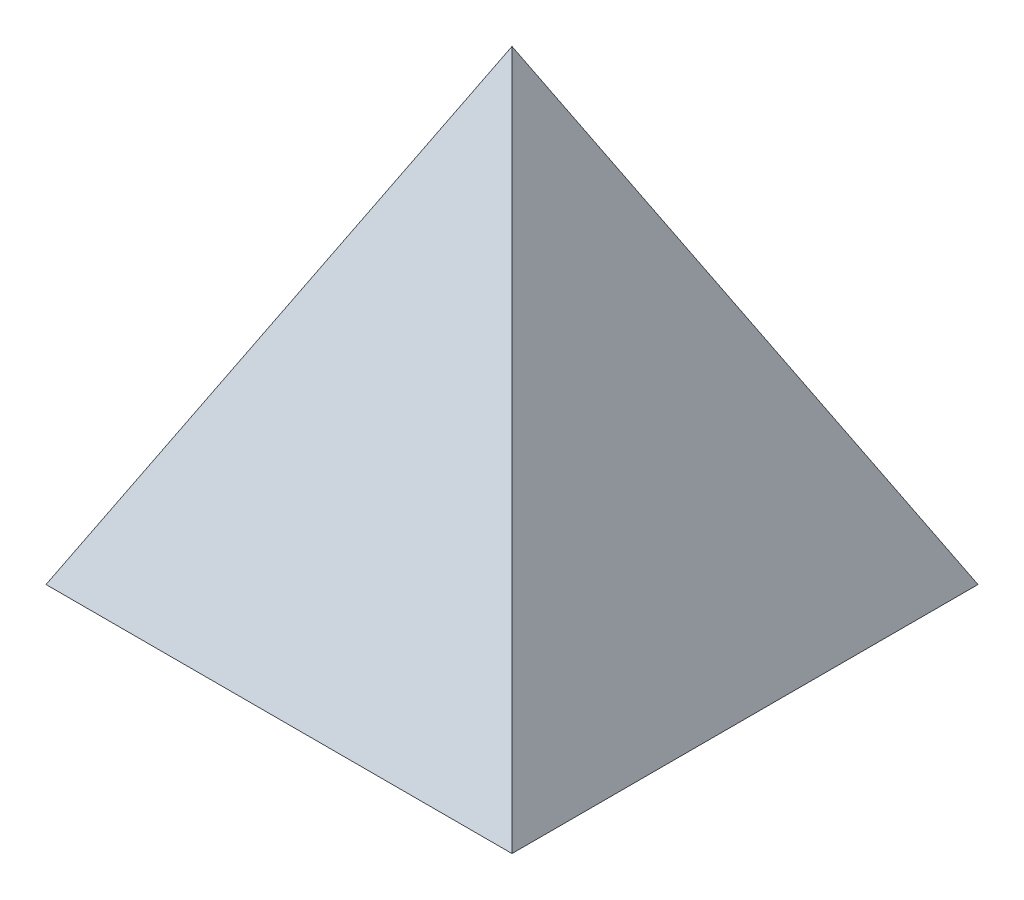
ISO-10303-21;
HEADER;
FILE_DESCRIPTION(('STEP AP214'),'2;1');
FILE_NAME('part.step','',(''),(''),'','','');
FILE_SCHEMA(('AUTOMOTIVE_DESIGN { 1 0 10303 214 1 1 1 1 }'));
ENDSEC;
DATA;
#1=APPLICATION_CONTEXT('core data for automotive mechanical design processes');
#2=APPLICATION_PROTOCOL_DEFINITION('international standard','automotive_design',2000,#1);
#3=PRODUCT_CONTEXT('',#1,'mechanical');
#4=PRODUCT('Part','Part','',(#3));
#5=PRODUCT_RELATED_PRODUCT_CATEGORY('part','',(#4));
#6=PRODUCT_DEFINITION_FORMATION('','',#4);
#7=PRODUCT_DEFINITION_CONTEXT('part definition',#1,'design');
#8=PRODUCT_DEFINITION('design','',#6,#7);
#9=PRODUCT_DEFINITION_SHAPE('','',#8);
#10=(LENGTH_UNIT() NAMED_UNIT(*) SI_UNIT(.MILLI.,.METRE.));
#11=(NAMED_UNIT(*) PLANE_ANGLE_UNIT() SI_UNIT($,.RADIAN.));
#12=(NAMED_UNIT(*) SI_UNIT($,.STERADIAN.) SOLID_ANGLE_UNIT());
#13=UNCERTAINTY_MEASURE_WITH_UNIT(LENGTH_MEASURE(1.E-05),#10,'distance_accuracy_value','');
#14=(GEOMETRIC_REPRESENTATION_CONTEXT(3) GLOBAL_UNCERTAINTY_ASSIGNED_CONTEXT((#13)) GLOBAL_UNIT_ASSIGNED_CONTEXT((#10,
#11,#12)) REPRESENTATION_CONTEXT('',''));
#15=CARTESIAN_POINT('',(0.,0.,0.));
#16=DIRECTION('',(0.,0.,1.));
#17=DIRECTION('',(1.,0.,0.));
#18=AXIS2_PLACEMENT_3D('',#15,#16,#17);
#19=CARTESIAN_POINT('',(250.,0.,250.));
#20=DIRECTION('',(0.894426809919611,0.447214357659756,0.));
#21=DIRECTION('',(-0.447214357659756,0.894426809919611,0.));
#22=AXIS2_PLACEMENT_3D('',#19,#20,#21);
#23=PLANE('',#22);
#24=DIRECTION('',(0.,0.,-1.));
#25=VECTOR('',#24,1.);
#26=CARTESIAN_POINT('',(250.,0.,250.));
#27=LINE('',#26,#25);
#28=CARTESIAN_POINT('',(250.,0.,250.));
#29=VERTEX_POINT('',#28);
#30=CARTESIAN_POINT('',(250.,0.,-250.));
#31=VERTEX_POINT('',#30);
#32=EDGE_CURVE('E81',#29,#31,#27,.T.);
#33=ORIENTED_EDGE('',*,*,#32,.T.);
#34=DIRECTION('',(0.408248870258218,-0.816496001132753,-0.408248870258218));
#35=VECTOR('',#34,1.);
#36=CARTESIAN_POINT('',(166.666429966444,166.6667850164,-166.666429966444));
#37=LINE('',#36,#35);
#38=CARTESIAN_POINT('',(1.17961196366423E-13,499.99893485089,0.));
#39=VERTEX_POINT('',#38);
#40=EDGE_CURVE('E11',#39,#31,#37,.T.);
#41=ORIENTED_EDGE('',*,*,#40,.F.);
#42=DIRECTION('',(0.408248870258218,-0.816496001132753,0.408248870258218));
#43=VECTOR('',#42,1.);
#44=CARTESIAN_POINT('',(250.,0.,250.));
#45=LINE('',#44,#43);
#46=EDGE_CURVE('E66',#39,#29,#45,.T.);
#47=ORIENTED_EDGE('',*,*,#46,.T.);
#48=EDGE_LOOP('',(#33,#41,#47));
#49=FACE_BOUND('',#48,.T.);
#50=ADVANCED_FACE('F43',(#49),#23,.T.);
#51=CARTESIAN_POINT('',(-250.,0.,-250.));
#52=DIRECTION('',(0.,0.447214357659756,-0.894426809919611));
#53=DIRECTION('',(0.,0.894426809919611,0.447214357659756));
#54=AXIS2_PLACEMENT_3D('',#51,#52,#53);
#55=PLANE('',#54);
#56=DIRECTION('',(-1.,0.,0.));
#57=VECTOR('',#56,1.);
#58=CARTESIAN_POINT('',(-250.,0.,-250.));
#59=LINE('',#58,#57);
#60=CARTESIAN_POINT('',(-250.,0.,-250.));
#61=VERTEX_POINT('',#60);
#62=EDGE_CURVE('E78',#31,#61,#59,.T.);
#63=ORIENTED_EDGE('',*,*,#62,.T.);
#64=DIRECTION('',(-0.408248870258218,-0.816496001132753,-0.408248870258218));
#65=VECTOR('',#64,1.);
#66=CARTESIAN_POINT('',(-166.666429966444,166.6667850164,-166.666429966444));
#67=LINE('',#66,#65);
#68=EDGE_CURVE('E47',#39,#61,#67,.T.);
#69=ORIENTED_EDGE('',*,*,#68,.F.);
#70=ORIENTED_EDGE('',*,*,#40,.T.);
#71=EDGE_LOOP('',(#63,#69,#70));
#72=FACE_BOUND('',#71,.T.);
#73=ADVANCED_FACE('F45',(#72),#55,.T.);
#74=CARTESIAN_POINT('',(-250.,0.,250.));
#75=DIRECTION('',(-0.894426809919611,0.447214357659756,0.));
#76=DIRECTION('',(-0.447214357659756,-0.894426809919611,0.));
#77=AXIS2_PLACEMENT_3D('',#74,#75,#76);
#78=PLANE('',#77);
#79=DIRECTION('',(0.,0.,1.));
#80=VECTOR('',#79,1.);
#81=CARTESIAN_POINT('',(-250.,0.,250.));
#82=LINE('',#81,#80);
#83=CARTESIAN_POINT('',(-250.,0.,250.));
#84=VERTEX_POINT('',#83);
#85=EDGE_CURVE('E83',#61,#84,#82,.T.);
#86=ORIENTED_EDGE('',*,*,#85,.T.);
#87=DIRECTION('',(-0.408248870258218,-0.816496001132753,0.408248870258218));
#88=VECTOR('',#87,1.);
#89=CARTESIAN_POINT('',(-250.,0.,250.));
#90=LINE('',#89,#88);
#91=EDGE_CURVE('E95',#39,#84,#90,.T.);
#92=ORIENTED_EDGE('',*,*,#91,.F.);
#93=ORIENTED_EDGE('',*,*,#68,.T.);
#94=EDGE_LOOP('',(#86,#92,#93));
#95=FACE_BOUND('',#94,.T.);
#96=ADVANCED_FACE('F100',(#95),#78,.T.);
#97=CARTESIAN_POINT('',(-250.,0.,250.));
#98=DIRECTION('',(0.,0.447214357659756,0.894426809919611));
#99=DIRECTION('',(0.,-0.894426809919611,0.447214357659756));
#100=AXIS2_PLACEMENT_3D('',#97,#98,#99);
#101=PLANE('',#100);
#102=DIRECTION('',(1.,0.,0.));
#103=VECTOR('',#102,1.);
#104=CARTESIAN_POINT('',(-250.,0.,250.));
#105=LINE('',#104,#103);
#106=EDGE_CURVE('E91',#84,#29,#105,.T.);
#107=ORIENTED_EDGE('',*,*,#106,.T.);
#108=ORIENTED_EDGE('',*,*,#46,.F.);
#109=ORIENTED_EDGE('',*,*,#91,.T.);
#110=EDGE_LOOP('',(#107,#108,#109));
#111=FACE_BOUND('',#110,.T.);
#112=ADVANCED_FACE('F101',(#111),#101,.T.);
#113=CARTESIAN_POINT('',(0.,0.,0.));
#114=DIRECTION('',(0.,-1.,0.));
#115=DIRECTION('',(0.,0.,-1.));
#116=AXIS2_PLACEMENT_3D('',#113,#114,#115);
#117=PLANE('',#116);
#118=ORIENTED_EDGE('',*,*,#32,.F.);
#119=ORIENTED_EDGE('',*,*,#106,.F.);
#120=ORIENTED_EDGE('',*,*,#85,.F.);
#121=ORIENTED_EDGE('',*,*,#62,.F.);
#122=EDGE_LOOP('',(#118,#119,#120,#121));
#123=FACE_BOUND('',#122,.T.);
#124=ADVANCED_FACE('F79',(#123),#117,.T.);
#125=CLOSED_SHELL('',(#50,#73,#96,#112,#124));
#126=MANIFOLD_SOLID_BREP('B2',#125);
#127=ADVANCED_BREP_SHAPE_REPRESENTATION('',(#18,#126),#14);
#128=SHAPE_DEFINITION_REPRESENTATION(#9,#127);
ENDSEC;
END-ISO-10303-21;
